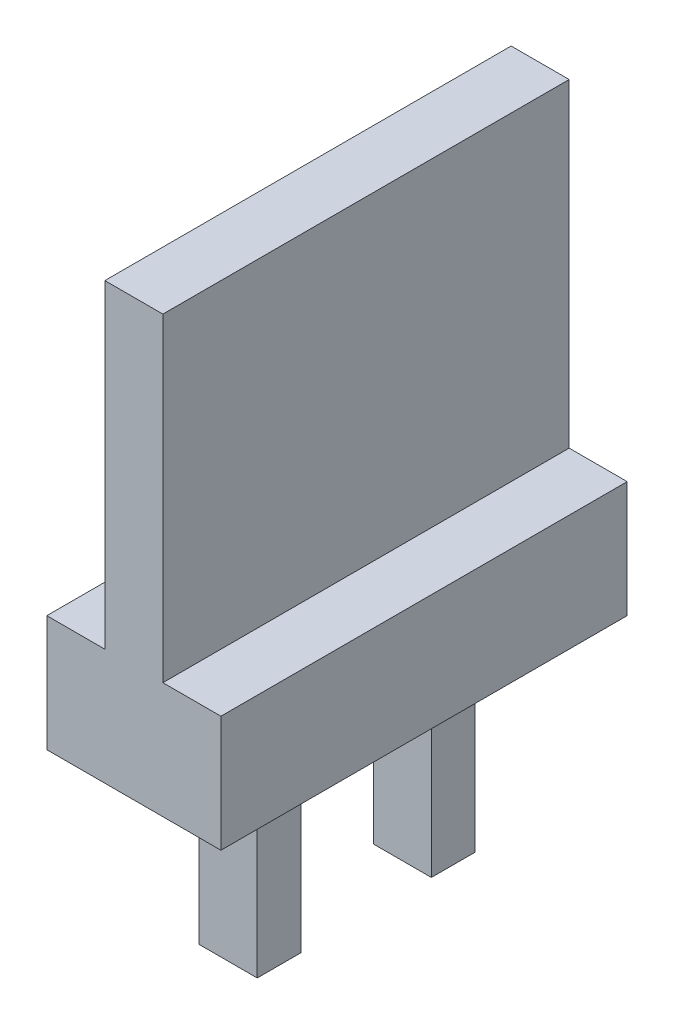
ISO-10303-21;
HEADER;
FILE_DESCRIPTION(('STEP AP214'),'2;1');
FILE_NAME('part.step','',(''),(''),'','','');
FILE_SCHEMA(('AUTOMOTIVE_DESIGN { 1 0 10303 214 1 1 1 1 }'));
ENDSEC;
DATA;
#1=APPLICATION_CONTEXT('core data for automotive mechanical design processes');
#2=APPLICATION_PROTOCOL_DEFINITION('international standard','automotive_design',2000,#1);
#3=PRODUCT_CONTEXT('',#1,'mechanical');
#4=PRODUCT('Part','Part','',(#3));
#5=PRODUCT_RELATED_PRODUCT_CATEGORY('part','',(#4));
#6=PRODUCT_DEFINITION_FORMATION('','',#4);
#7=PRODUCT_DEFINITION_CONTEXT('part definition',#1,'design');
#8=PRODUCT_DEFINITION('design','',#6,#7);
#9=PRODUCT_DEFINITION_SHAPE('','',#8);
#10=(LENGTH_UNIT() NAMED_UNIT(*) SI_UNIT(.MILLI.,.METRE.));
#11=(NAMED_UNIT(*) PLANE_ANGLE_UNIT() SI_UNIT($,.RADIAN.));
#12=(NAMED_UNIT(*) SI_UNIT($,.STERADIAN.) SOLID_ANGLE_UNIT());
#13=UNCERTAINTY_MEASURE_WITH_UNIT(LENGTH_MEASURE(1.E-05),#10,'distance_accuracy_value','');
#14=(GEOMETRIC_REPRESENTATION_CONTEXT(3) GLOBAL_UNCERTAINTY_ASSIGNED_CONTEXT((#13)) GLOBAL_UNIT_ASSIGNED_CONTEXT((#10,
#11,#12)) REPRESENTATION_CONTEXT('',''));
#15=CARTESIAN_POINT('',(0.,0.,0.));
#16=DIRECTION('',(0.,0.,1.));
#17=DIRECTION('',(1.,0.,0.));
#18=AXIS2_PLACEMENT_3D('',#15,#16,#17);
#19=CARTESIAN_POINT('',(-2.20614541019622,-8.26530612244898,9.5));
#20=DIRECTION('',(0.,1.,0.));
#21=DIRECTION('',(0.,0.,1.));
#22=AXIS2_PLACEMENT_3D('',#19,#20,#21);
#23=PLANE('',#22);
#24=DIRECTION('',(1.,0.,0.));
#25=VECTOR('',#24,1.);
#26=CARTESIAN_POINT('',(-2.20614541019622,-8.26530612244898,6.5));
#27=LINE('',#26,#25);
#28=CARTESIAN_POINT('',(-2.20614541019622,-8.26530612244898,6.5));
#29=VERTEX_POINT('',#28);
#30=CARTESIAN_POINT('',(1.79385458980378,-8.26530612244898,6.5));
#31=VERTEX_POINT('',#30);
#32=EDGE_CURVE('E108',#29,#31,#27,.T.);
#33=ORIENTED_EDGE('',*,*,#32,.F.);
#34=DIRECTION('',(0.,0.,-1.));
#35=VECTOR('',#34,1.);
#36=CARTESIAN_POINT('',(-2.20614541019622,-8.26530612244898,9.5));
#37=LINE('',#36,#35);
#38=CARTESIAN_POINT('',(-2.20614541019622,-8.26530612244898,9.5));
#39=VERTEX_POINT('',#38);
#40=EDGE_CURVE('E12',#39,#29,#37,.T.);
#41=ORIENTED_EDGE('',*,*,#40,.F.);
#42=DIRECTION('',(1.,0.,0.));
#43=VECTOR('',#42,1.);
#44=CARTESIAN_POINT('',(-2.20614541019622,-8.26530612244898,9.5));
#45=LINE('',#44,#43);
#46=CARTESIAN_POINT('',(1.79385458980378,-8.26530612244898,9.5));
#47=VERTEX_POINT('',#46);
#48=EDGE_CURVE('E102',#39,#47,#45,.T.);
#49=ORIENTED_EDGE('',*,*,#48,.T.);
#50=DIRECTION('',(0.,0.,-1.));
#51=VECTOR('',#50,1.);
#52=CARTESIAN_POINT('',(1.79385458980378,-8.26530612244898,9.5));
#53=LINE('',#52,#51);
#54=EDGE_CURVE('E47',#47,#31,#53,.T.);
#55=ORIENTED_EDGE('',*,*,#54,.T.);
#56=EDGE_LOOP('',(#33,#41,#49,#55));
#57=FACE_BOUND('',#56,.T.);
#58=ADVANCED_FACE('F44',(#57),#23,.T.);
#59=CARTESIAN_POINT('',(-2.20614541019622,-19.139320219842,9.5));
#60=DIRECTION('',(-1.,0.,0.));
#61=DIRECTION('',(0.,0.,1.));
#62=AXIS2_PLACEMENT_3D('',#59,#60,#61);
#63=PLANE('',#62);
#64=DIRECTION('',(0.,1.,0.));
#65=VECTOR('',#64,1.);
#66=CARTESIAN_POINT('',(-2.20614541019622,-19.139320219842,6.5));
#67=LINE('',#66,#65);
#68=CARTESIAN_POINT('',(-2.20614541019622,-19.139320219842,6.5));
#69=VERTEX_POINT('',#68);
#70=EDGE_CURVE('E104',#69,#29,#67,.T.);
#71=ORIENTED_EDGE('',*,*,#70,.F.);
#72=DIRECTION('',(0.,0.,-1.));
#73=VECTOR('',#72,1.);
#74=CARTESIAN_POINT('',(-2.20614541019622,-19.139320219842,9.5));
#75=LINE('',#74,#73);
#76=CARTESIAN_POINT('',(-2.20614541019622,-19.139320219842,9.5));
#77=VERTEX_POINT('',#76);
#78=EDGE_CURVE('E53',#77,#69,#75,.T.);
#79=ORIENTED_EDGE('',*,*,#78,.F.);
#80=DIRECTION('',(0.,1.,0.));
#81=VECTOR('',#80,1.);
#82=CARTESIAN_POINT('',(-2.20614541019622,-19.139320219842,9.5));
#83=LINE('',#82,#81);
#84=EDGE_CURVE('E99',#77,#39,#83,.T.);
#85=ORIENTED_EDGE('',*,*,#84,.T.);
#86=ORIENTED_EDGE('',*,*,#40,.T.);
#87=EDGE_LOOP('',(#71,#79,#85,#86));
#88=FACE_BOUND('',#87,.T.);
#89=ADVANCED_FACE('F118',(#88),#63,.T.);
#90=CARTESIAN_POINT('',(1.79385458980378,-19.139320219842,9.5));
#91=DIRECTION('',(0.,-1.,0.));
#92=DIRECTION('',(0.,0.,-1.));
#93=AXIS2_PLACEMENT_3D('',#90,#91,#92);
#94=PLANE('',#93);
#95=DIRECTION('',(-1.,0.,0.));
#96=VECTOR('',#95,1.);
#97=CARTESIAN_POINT('',(1.79385458980378,-19.139320219842,6.5));
#98=LINE('',#97,#96);
#99=CARTESIAN_POINT('',(1.79385458980378,-19.139320219842,6.5));
#100=VERTEX_POINT('',#99);
#101=EDGE_CURVE('E94',#100,#69,#98,.T.);
#102=ORIENTED_EDGE('',*,*,#101,.F.);
#103=DIRECTION('',(0.,0.,-1.));
#104=VECTOR('',#103,1.);
#105=CARTESIAN_POINT('',(1.79385458980378,-19.139320219842,9.5));
#106=LINE('',#105,#104);
#107=CARTESIAN_POINT('',(1.79385458980378,-19.139320219842,9.5));
#108=VERTEX_POINT('',#107);
#109=EDGE_CURVE('E89',#108,#100,#106,.T.);
#110=ORIENTED_EDGE('',*,*,#109,.F.);
#111=DIRECTION('',(-1.,0.,0.));
#112=VECTOR('',#111,1.);
#113=CARTESIAN_POINT('',(1.79385458980378,-19.139320219842,9.5));
#114=LINE('',#113,#112);
#115=EDGE_CURVE('E92',#108,#77,#114,.T.);
#116=ORIENTED_EDGE('',*,*,#115,.T.);
#117=ORIENTED_EDGE('',*,*,#78,.T.);
#118=EDGE_LOOP('',(#102,#110,#116,#117));
#119=FACE_BOUND('',#118,.T.);
#120=ADVANCED_FACE('F91',(#119),#94,.T.);
#121=CARTESIAN_POINT('',(1.79385458980378,-8.26530612244898,9.5));
#122=DIRECTION('',(1.,0.,0.));
#123=DIRECTION('',(0.,0.,-1.));
#124=AXIS2_PLACEMENT_3D('',#121,#122,#123);
#125=PLANE('',#124);
#126=DIRECTION('',(0.,-1.,0.));
#127=VECTOR('',#126,1.);
#128=CARTESIAN_POINT('',(1.79385458980378,-8.26530612244898,6.5));
#129=LINE('',#128,#127);
#130=EDGE_CURVE('E111',#31,#100,#129,.T.);
#131=ORIENTED_EDGE('',*,*,#130,.F.);
#132=ORIENTED_EDGE('',*,*,#54,.F.);
#133=DIRECTION('',(0.,-1.,0.));
#134=VECTOR('',#133,1.);
#135=CARTESIAN_POINT('',(1.79385458980378,-8.26530612244898,9.5));
#136=LINE('',#135,#134);
#137=EDGE_CURVE('E98',#47,#108,#136,.T.);
#138=ORIENTED_EDGE('',*,*,#137,.T.);
#139=ORIENTED_EDGE('',*,*,#109,.T.);
#140=EDGE_LOOP('',(#131,#132,#138,#139));
#141=FACE_BOUND('',#140,.T.);
#142=ADVANCED_FACE('F101',(#141),#125,.T.);
#143=CARTESIAN_POINT('',(0.,0.,9.5));
#144=DIRECTION('',(0.,0.,-1.));
#145=DIRECTION('',(-1.,0.,0.));
#146=AXIS2_PLACEMENT_3D('',#143,#144,#145);
#147=PLANE('',#146);
#148=ORIENTED_EDGE('',*,*,#48,.F.);
#149=ORIENTED_EDGE('',*,*,#84,.F.);
#150=ORIENTED_EDGE('',*,*,#115,.F.);
#151=ORIENTED_EDGE('',*,*,#137,.F.);
#152=EDGE_LOOP('',(#148,#149,#150,#151));
#153=FACE_BOUND('',#152,.T.);
#154=ADVANCED_FACE('F97',(#153),#147,.F.);
#155=CARTESIAN_POINT('',(0.,0.,6.5));
#156=DIRECTION('',(0.,0.,-1.));
#157=DIRECTION('',(-1.,0.,0.));
#158=AXIS2_PLACEMENT_3D('',#155,#156,#157);
#159=PLANE('',#158);
#160=ORIENTED_EDGE('',*,*,#32,.T.);
#161=ORIENTED_EDGE('',*,*,#130,.T.);
#162=ORIENTED_EDGE('',*,*,#101,.T.);
#163=ORIENTED_EDGE('',*,*,#70,.T.);
#164=EDGE_LOOP('',(#160,#161,#162,#163));
#165=FACE_BOUND('',#164,.T.);
#166=ADVANCED_FACE('F117',(#165),#159,.T.);
#167=CLOSED_SHELL('',(#58,#89,#120,#142,#154,#166));
#168=MANIFOLD_SOLID_BREP('B2',#167);
#169=CARTESIAN_POINT('',(5.79136789851076,-6.26530612244898,28.));
#170=DIRECTION('',(0.,1.,0.));
#171=DIRECTION('',(-1.,0.,0.));
#172=AXIS2_PLACEMENT_3D('',#169,#170,#171);
#173=PLANE('',#172);
#174=DIRECTION('',(1.,0.,0.));
#175=VECTOR('',#174,1.);
#176=CARTESIAN_POINT('',(5.79136789851076,-6.26530612244898,0.));
#177=LINE('',#176,#175);
#178=CARTESIAN_POINT('',(-6.20863210148924,-6.26530612244898,0.));
#179=VERTEX_POINT('',#178);
#180=CARTESIAN_POINT('',(5.79136789851076,-6.26530612244898,0.));
#181=VERTEX_POINT('',#180);
#182=EDGE_CURVE('E370',#179,#181,#177,.T.);
#183=ORIENTED_EDGE('',*,*,#182,.T.);
#184=DIRECTION('',(0.,0.,-1.));
#185=VECTOR('',#184,1.);
#186=CARTESIAN_POINT('',(5.79136789851076,-6.26530612244898,28.));
#187=LINE('',#186,#185);
#188=CARTESIAN_POINT('',(5.79136789851076,-6.26530612244898,28.));
#189=VERTEX_POINT('',#188);
#190=EDGE_CURVE('E395',#189,#181,#187,.T.);
#191=ORIENTED_EDGE('',*,*,#190,.F.);
#192=DIRECTION('',(1.,0.,0.));
#193=VECTOR('',#192,1.);
#194=CARTESIAN_POINT('',(5.79136789851076,-6.26530612244898,28.));
#195=LINE('',#194,#193);
#196=CARTESIAN_POINT('',(-6.20863210148924,-6.26530612244898,28.));
#197=VERTEX_POINT('',#196);
#198=EDGE_CURVE('E353',#197,#189,#195,.T.);
#199=ORIENTED_EDGE('',*,*,#198,.F.);
#200=DIRECTION('',(0.,0.,-1.));
#201=VECTOR('',#200,1.);
#202=CARTESIAN_POINT('',(-6.20863210148924,-6.26530612244898,28.));
#203=LINE('',#202,#201);
#204=EDGE_CURVE('E175',#197,#179,#203,.T.);
#205=ORIENTED_EDGE('',*,*,#204,.T.);
#206=EDGE_LOOP('',(#183,#191,#199,#205));
#207=FACE_BOUND('',#206,.T.);
#208=DIRECTION('',(-1.,0.,0.));
#209=VECTOR('',#208,1.);
#210=CARTESIAN_POINT('',(3.79136789851076,-6.26530612244898,21.5));
#211=LINE('',#210,#209);
#212=CARTESIAN_POINT('',(3.79136789851076,-6.26530612244898,21.5));
#213=VERTEX_POINT('',#212);
#214=CARTESIAN_POINT('',(-4.20863210148925,-6.26530612244898,21.5));
#215=VERTEX_POINT('',#214);
#216=EDGE_CURVE('E190',#213,#215,#211,.T.);
#217=ORIENTED_EDGE('',*,*,#216,.F.);
#218=DIRECTION('',(0.,0.,1.));
#219=VECTOR('',#218,1.);
#220=CARTESIAN_POINT('',(3.79136789851076,-6.26530612244898,6.5));
#221=LINE('',#220,#219);
#222=CARTESIAN_POINT('',(3.79136789851076,-6.26530612244898,6.5));
#223=VERTEX_POINT('',#222);
#224=EDGE_CURVE('E333',#223,#213,#221,.T.);
#225=ORIENTED_EDGE('',*,*,#224,.F.);
#226=DIRECTION('',(1.,0.,0.));
#227=VECTOR('',#226,1.);
#228=CARTESIAN_POINT('',(-4.20863210148924,-6.26530612244898,6.5));
#229=LINE('',#228,#227);
#230=CARTESIAN_POINT('',(-4.20863210148924,-6.26530612244898,6.5));
#231=VERTEX_POINT('',#230);
#232=EDGE_CURVE('E330',#231,#223,#229,.T.);
#233=ORIENTED_EDGE('',*,*,#232,.F.);
#234=DIRECTION('',(0.,0.,-1.));
#235=VECTOR('',#234,1.);
#236=CARTESIAN_POINT('',(-4.20863210148925,-6.26530612244898,21.5));
#237=LINE('',#236,#235);
#238=EDGE_CURVE('E327',#215,#231,#237,.T.);
#239=ORIENTED_EDGE('',*,*,#238,.F.);
#240=EDGE_LOOP('',(#217,#225,#233,#239));
#241=FACE_BOUND('',#240,.T.);
#242=ADVANCED_FACE('F167',(#207,#241),#173,.F.);
#243=CARTESIAN_POINT('',(-6.20863210148924,1.73469387755102,28.));
#244=DIRECTION('',(0.,-1.,0.));
#245=DIRECTION('',(0.,0.,-1.));
#246=AXIS2_PLACEMENT_3D('',#243,#244,#245);
#247=PLANE('',#246);
#248=DIRECTION('',(-1.,0.,0.));
#249=VECTOR('',#248,1.);
#250=CARTESIAN_POINT('',(-6.20863210148924,1.73469387755102,0.));
#251=LINE('',#250,#249);
#252=CARTESIAN_POINT('',(-2.20863210148924,1.73469387755102,0.));
#253=VERTEX_POINT('',#252);
#254=CARTESIAN_POINT('',(-6.20863210148924,1.73469387755102,0.));
#255=VERTEX_POINT('',#254);
#256=EDGE_CURVE('E346',#253,#255,#251,.T.);
#257=ORIENTED_EDGE('',*,*,#256,.T.);
#258=DIRECTION('',(0.,0.,-1.));
#259=VECTOR('',#258,1.);
#260=CARTESIAN_POINT('',(-6.20863210148924,1.73469387755102,28.));
#261=LINE('',#260,#259);
#262=CARTESIAN_POINT('',(-6.20863210148924,1.73469387755102,28.));
#263=VERTEX_POINT('',#262);
#264=EDGE_CURVE('E42',#263,#255,#261,.T.);
#265=ORIENTED_EDGE('',*,*,#264,.F.);
#266=DIRECTION('',(-1.,0.,0.));
#267=VECTOR('',#266,1.);
#268=CARTESIAN_POINT('',(-6.20863210148924,1.73469387755102,28.));
#269=LINE('',#268,#267);
#270=CARTESIAN_POINT('',(-2.20863210148924,1.73469387755102,28.));
#271=VERTEX_POINT('',#270);
#272=EDGE_CURVE('E347',#271,#263,#269,.T.);
#273=ORIENTED_EDGE('',*,*,#272,.F.);
#274=DIRECTION('',(0.,0.,-1.));
#275=VECTOR('',#274,1.);
#276=CARTESIAN_POINT('',(-2.20863210148924,1.73469387755102,28.));
#277=LINE('',#276,#275);
#278=EDGE_CURVE('E365',#271,#253,#277,.T.);
#279=ORIENTED_EDGE('',*,*,#278,.T.);
#280=EDGE_LOOP('',(#257,#265,#273,#279));
#281=FACE_BOUND('',#280,.T.);
#282=ADVANCED_FACE('F169',(#281),#247,.F.);
#283=CARTESIAN_POINT('',(-6.20863210148924,-6.26530612244898,28.));
#284=DIRECTION('',(1.,0.,0.));
#285=DIRECTION('',(0.,1.,0.));
#286=AXIS2_PLACEMENT_3D('',#283,#284,#285);
#287=PLANE('',#286);
#288=DIRECTION('',(0.,-1.,0.));
#289=VECTOR('',#288,1.);
#290=CARTESIAN_POINT('',(-6.20863210148924,-6.26530612244898,0.));
#291=LINE('',#290,#289);
#292=EDGE_CURVE('E368',#255,#179,#291,.T.);
#293=ORIENTED_EDGE('',*,*,#292,.T.);
#294=ORIENTED_EDGE('',*,*,#204,.F.);
#295=DIRECTION('',(0.,-1.,0.));
#296=VECTOR('',#295,1.);
#297=CARTESIAN_POINT('',(-6.20863210148924,-6.26530612244898,28.));
#298=LINE('',#297,#296);
#299=EDGE_CURVE('E350',#263,#197,#298,.T.);
#300=ORIENTED_EDGE('',*,*,#299,.F.);
#301=ORIENTED_EDGE('',*,*,#264,.T.);
#302=EDGE_LOOP('',(#293,#294,#300,#301));
#303=FACE_BOUND('',#302,.T.);
#304=ADVANCED_FACE('F424',(#303),#287,.F.);
#305=CARTESIAN_POINT('',(5.79136789851076,1.73469387755102,28.));
#306=DIRECTION('',(-1.,0.,0.));
#307=DIRECTION('',(0.,-1.,0.));
#308=AXIS2_PLACEMENT_3D('',#305,#306,#307);
#309=PLANE('',#308);
#310=DIRECTION('',(0.,1.,0.));
#311=VECTOR('',#310,1.);
#312=CARTESIAN_POINT('',(5.79136789851076,1.73469387755102,0.));
#313=LINE('',#312,#311);
#314=CARTESIAN_POINT('',(5.79136789851076,1.73469387755102,0.));
#315=VERTEX_POINT('',#314);
#316=EDGE_CURVE('E372',#181,#315,#313,.T.);
#317=ORIENTED_EDGE('',*,*,#316,.T.);
#318=DIRECTION('',(0.,0.,-1.));
#319=VECTOR('',#318,1.);
#320=CARTESIAN_POINT('',(5.79136789851076,1.73469387755102,28.));
#321=LINE('',#320,#319);
#322=CARTESIAN_POINT('',(5.79136789851076,1.73469387755102,28.));
#323=VERTEX_POINT('',#322);
#324=EDGE_CURVE('E392',#323,#315,#321,.T.);
#325=ORIENTED_EDGE('',*,*,#324,.F.);
#326=DIRECTION('',(0.,1.,0.));
#327=VECTOR('',#326,1.);
#328=CARTESIAN_POINT('',(5.79136789851076,1.73469387755102,28.));
#329=LINE('',#328,#327);
#330=EDGE_CURVE('E355',#189,#323,#329,.T.);
#331=ORIENTED_EDGE('',*,*,#330,.F.);
#332=ORIENTED_EDGE('',*,*,#190,.T.);
#333=EDGE_LOOP('',(#317,#325,#331,#332));
#334=FACE_BOUND('',#333,.T.);
#335=ADVANCED_FACE('F412',(#334),#309,.F.);
#336=CARTESIAN_POINT('',(1.79136789851076,1.73469387755102,28.));
#337=DIRECTION('',(0.,-1.,0.));
#338=DIRECTION('',(0.,0.,-1.));
#339=AXIS2_PLACEMENT_3D('',#336,#337,#338);
#340=PLANE('',#339);
#341=DIRECTION('',(-1.,0.,0.));
#342=VECTOR('',#341,1.);
#343=CARTESIAN_POINT('',(1.79136789851076,1.73469387755102,0.));
#344=LINE('',#343,#342);
#345=CARTESIAN_POINT('',(1.79136789851076,1.73469387755102,0.));
#346=VERTEX_POINT('',#345);
#347=EDGE_CURVE('E374',#315,#346,#344,.T.);
#348=ORIENTED_EDGE('',*,*,#347,.T.);
#349=DIRECTION('',(0.,0.,-1.));
#350=VECTOR('',#349,1.);
#351=CARTESIAN_POINT('',(1.79136789851076,1.73469387755102,28.));
#352=LINE('',#351,#350);
#353=CARTESIAN_POINT('',(1.79136789851076,1.73469387755102,28.));
#354=VERTEX_POINT('',#353);
#355=EDGE_CURVE('E389',#354,#346,#352,.T.);
#356=ORIENTED_EDGE('',*,*,#355,.F.);
#357=DIRECTION('',(-1.,0.,0.));
#358=VECTOR('',#357,1.);
#359=CARTESIAN_POINT('',(1.79136789851076,1.73469387755102,28.));
#360=LINE('',#359,#358);
#361=EDGE_CURVE('E357',#323,#354,#360,.T.);
#362=ORIENTED_EDGE('',*,*,#361,.F.);
#363=ORIENTED_EDGE('',*,*,#324,.T.);
#364=EDGE_LOOP('',(#348,#356,#362,#363));
#365=FACE_BOUND('',#364,.T.);
#366=ADVANCED_FACE('F416',(#365),#340,.F.);
#367=CARTESIAN_POINT('',(1.79136789851076,23.734693877551,28.));
#368=DIRECTION('',(-1.,0.,0.));
#369=DIRECTION('',(0.,-1.,0.));
#370=AXIS2_PLACEMENT_3D('',#367,#368,#369);
#371=PLANE('',#370);
#372=DIRECTION('',(0.,1.,0.));
#373=VECTOR('',#372,1.);
#374=CARTESIAN_POINT('',(1.79136789851076,23.734693877551,0.));
#375=LINE('',#374,#373);
#376=CARTESIAN_POINT('',(1.79136789851076,23.734693877551,0.));
#377=VERTEX_POINT('',#376);
#378=EDGE_CURVE('E376',#346,#377,#375,.T.);
#379=ORIENTED_EDGE('',*,*,#378,.T.);
#380=DIRECTION('',(0.,0.,-1.));
#381=VECTOR('',#380,1.);
#382=CARTESIAN_POINT('',(1.79136789851076,23.734693877551,28.));
#383=LINE('',#382,#381);
#384=CARTESIAN_POINT('',(1.79136789851076,23.734693877551,28.));
#385=VERTEX_POINT('',#384);
#386=EDGE_CURVE('E386',#385,#377,#383,.T.);
#387=ORIENTED_EDGE('',*,*,#386,.F.);
#388=DIRECTION('',(0.,1.,0.));
#389=VECTOR('',#388,1.);
#390=CARTESIAN_POINT('',(1.79136789851076,23.734693877551,28.));
#391=LINE('',#390,#389);
#392=EDGE_CURVE('E359',#354,#385,#391,.T.);
#393=ORIENTED_EDGE('',*,*,#392,.F.);
#394=ORIENTED_EDGE('',*,*,#355,.T.);
#395=EDGE_LOOP('',(#379,#387,#393,#394));
#396=FACE_BOUND('',#395,.T.);
#397=ADVANCED_FACE('F437',(#396),#371,.F.);
#398=CARTESIAN_POINT('',(-2.20863210148924,23.734693877551,28.));
#399=DIRECTION('',(0.,-1.,0.));
#400=DIRECTION('',(0.,0.,-1.));
#401=AXIS2_PLACEMENT_3D('',#398,#399,#400);
#402=PLANE('',#401);
#403=DIRECTION('',(-1.,0.,0.));
#404=VECTOR('',#403,1.);
#405=CARTESIAN_POINT('',(-2.20863210148924,23.734693877551,0.));
#406=LINE('',#405,#404);
#407=CARTESIAN_POINT('',(-2.20863210148924,23.734693877551,0.));
#408=VERTEX_POINT('',#407);
#409=EDGE_CURVE('E378',#377,#408,#406,.T.);
#410=ORIENTED_EDGE('',*,*,#409,.T.);
#411=DIRECTION('',(0.,0.,-1.));
#412=VECTOR('',#411,1.);
#413=CARTESIAN_POINT('',(-2.20863210148924,23.734693877551,28.));
#414=LINE('',#413,#412);
#415=CARTESIAN_POINT('',(-2.20863210148924,23.734693877551,28.));
#416=VERTEX_POINT('',#415);
#417=EDGE_CURVE('E383',#416,#408,#414,.T.);
#418=ORIENTED_EDGE('',*,*,#417,.F.);
#419=DIRECTION('',(-1.,0.,0.));
#420=VECTOR('',#419,1.);
#421=CARTESIAN_POINT('',(-2.20863210148924,23.734693877551,28.));
#422=LINE('',#421,#420);
#423=EDGE_CURVE('E361',#385,#416,#422,.T.);
#424=ORIENTED_EDGE('',*,*,#423,.F.);
#425=ORIENTED_EDGE('',*,*,#386,.T.);
#426=EDGE_LOOP('',(#410,#418,#424,#425));
#427=FACE_BOUND('',#426,.T.);
#428=ADVANCED_FACE('F435',(#427),#402,.F.);
#429=CARTESIAN_POINT('',(-2.20863210148924,1.73469387755102,28.));
#430=DIRECTION('',(1.,0.,0.));
#431=DIRECTION('',(0.,1.,0.));
#432=AXIS2_PLACEMENT_3D('',#429,#430,#431);
#433=PLANE('',#432);
#434=DIRECTION('',(0.,-1.,0.));
#435=VECTOR('',#434,1.);
#436=CARTESIAN_POINT('',(-2.20863210148924,1.73469387755102,0.));
#437=LINE('',#436,#435);
#438=EDGE_CURVE('E351',#408,#253,#437,.T.);
#439=ORIENTED_EDGE('',*,*,#438,.T.);
#440=ORIENTED_EDGE('',*,*,#278,.F.);
#441=DIRECTION('',(0.,-1.,0.));
#442=VECTOR('',#441,1.);
#443=CARTESIAN_POINT('',(-2.20863210148924,1.73469387755102,28.));
#444=LINE('',#443,#442);
#445=EDGE_CURVE('E363',#416,#271,#444,.T.);
#446=ORIENTED_EDGE('',*,*,#445,.F.);
#447=ORIENTED_EDGE('',*,*,#417,.T.);
#448=EDGE_LOOP('',(#439,#440,#446,#447));
#449=FACE_BOUND('',#448,.T.);
#450=ADVANCED_FACE('F430',(#449),#433,.F.);
#451=CARTESIAN_POINT('',(0.,0.,28.));
#452=DIRECTION('',(0.,0.,1.));
#453=DIRECTION('',(1.,0.,0.));
#454=AXIS2_PLACEMENT_3D('',#451,#452,#453);
#455=PLANE('',#454);
#456=ORIENTED_EDGE('',*,*,#272,.T.);
#457=ORIENTED_EDGE('',*,*,#299,.T.);
#458=ORIENTED_EDGE('',*,*,#198,.T.);
#459=ORIENTED_EDGE('',*,*,#330,.T.);
#460=ORIENTED_EDGE('',*,*,#361,.T.);
#461=ORIENTED_EDGE('',*,*,#392,.T.);
#462=ORIENTED_EDGE('',*,*,#423,.T.);
#463=ORIENTED_EDGE('',*,*,#445,.T.);
#464=EDGE_LOOP('',(#456,#457,#458,#459,#460,#461,#462,#463));
#465=FACE_BOUND('',#464,.T.);
#466=ADVANCED_FACE('F420',(#465),#455,.T.);
#467=CARTESIAN_POINT('',(0.,0.,0.));
#468=DIRECTION('',(0.,0.,1.));
#469=DIRECTION('',(1.,0.,0.));
#470=AXIS2_PLACEMENT_3D('',#467,#468,#469);
#471=PLANE('',#470);
#472=ORIENTED_EDGE('',*,*,#256,.F.);
#473=ORIENTED_EDGE('',*,*,#438,.F.);
#474=ORIENTED_EDGE('',*,*,#409,.F.);
#475=ORIENTED_EDGE('',*,*,#378,.F.);
#476=ORIENTED_EDGE('',*,*,#347,.F.);
#477=ORIENTED_EDGE('',*,*,#316,.F.);
#478=ORIENTED_EDGE('',*,*,#182,.F.);
#479=ORIENTED_EDGE('',*,*,#292,.F.);
#480=EDGE_LOOP('',(#472,#473,#474,#475,#476,#477,#478,#479));
#481=FACE_BOUND('',#480,.T.);
#482=ADVANCED_FACE('F407',(#481),#471,.F.);
#483=CARTESIAN_POINT('',(3.79136789851076,-8.26530612244898,21.5));
#484=DIRECTION('',(0.,0.,-1.));
#485=DIRECTION('',(-1.,0.,0.));
#486=AXIS2_PLACEMENT_3D('',#483,#484,#485);
#487=PLANE('',#486);
#488=ORIENTED_EDGE('',*,*,#216,.T.);
#489=DIRECTION('',(0.,1.,0.));
#490=VECTOR('',#489,1.);
#491=CARTESIAN_POINT('',(-4.20863210148925,-8.26530612244898,21.5));
#492=LINE('',#491,#490);
#493=CARTESIAN_POINT('',(-4.20863210148925,-8.26530612244898,21.5));
#494=VERTEX_POINT('',#493);
#495=EDGE_CURVE('E343',#494,#215,#492,.T.);
#496=ORIENTED_EDGE('',*,*,#495,.F.);
#497=DIRECTION('',(-1.,0.,0.));
#498=VECTOR('',#497,1.);
#499=CARTESIAN_POINT('',(3.79136789851076,-8.26530612244898,21.5));
#500=LINE('',#499,#498);
#501=CARTESIAN_POINT('',(-2.20614541019622,-8.26530612244898,21.5));
#502=VERTEX_POINT('',#501);
#503=EDGE_CURVE('E319',#502,#494,#500,.T.);
#504=ORIENTED_EDGE('',*,*,#503,.F.);
#505=DIRECTION('',(0.,-1.,0.));
#506=VECTOR('',#505,1.);
#507=CARTESIAN_POINT('',(-2.20614541019622,-8.26530612244898,21.5));
#508=LINE('',#507,#506);
#509=CARTESIAN_POINT('',(-2.20614541019622,-19.139320219842,21.5));
#510=VERTEX_POINT('',#509);
#511=EDGE_CURVE('E182',#502,#510,#508,.T.);
#512=ORIENTED_EDGE('',*,*,#511,.T.);
#513=DIRECTION('',(1.,0.,0.));
#514=VECTOR('',#513,1.);
#515=CARTESIAN_POINT('',(-2.20614541019622,-19.139320219842,21.5));
#516=LINE('',#515,#514);
#517=CARTESIAN_POINT('',(1.79385458980378,-19.139320219842,21.5));
#518=VERTEX_POINT('',#517);
#519=EDGE_CURVE('E304',#510,#518,#516,.T.);
#520=ORIENTED_EDGE('',*,*,#519,.T.);
#521=DIRECTION('',(0.,1.,0.));
#522=VECTOR('',#521,1.);
#523=CARTESIAN_POINT('',(1.79385458980378,-19.139320219842,21.5));
#524=LINE('',#523,#522);
#525=CARTESIAN_POINT('',(1.79385458980378,-8.26530612244898,21.5));
#526=VERTEX_POINT('',#525);
#527=EDGE_CURVE('E301',#518,#526,#524,.T.);
#528=ORIENTED_EDGE('',*,*,#527,.T.);
#529=CARTESIAN_POINT('',(3.79136789851076,-8.26530612244898,21.5));
#530=VERTEX_POINT('',#529);
#531=EDGE_CURVE('E316',#530,#526,#500,.T.);
#532=ORIENTED_EDGE('',*,*,#531,.F.);
#533=DIRECTION('',(0.,1.,0.));
#534=VECTOR('',#533,1.);
#535=CARTESIAN_POINT('',(3.79136789851076,-8.26530612244898,21.5));
#536=LINE('',#535,#534);
#537=EDGE_CURVE('E325',#530,#213,#536,.T.);
#538=ORIENTED_EDGE('',*,*,#537,.T.);
#539=EDGE_LOOP('',(#488,#496,#504,#512,#520,#528,#532,#538));
#540=FACE_BOUND('',#539,.T.);
#541=ADVANCED_FACE('F496',(#540),#487,.F.);
#542=CARTESIAN_POINT('',(-4.20863210148925,-8.26530612244898,21.5));
#543=DIRECTION('',(1.,0.,0.));
#544=DIRECTION('',(0.,1.,0.));
#545=AXIS2_PLACEMENT_3D('',#542,#543,#544);
#546=PLANE('',#545);
#547=ORIENTED_EDGE('',*,*,#238,.T.);
#548=DIRECTION('',(0.,1.,0.));
#549=VECTOR('',#548,1.);
#550=CARTESIAN_POINT('',(-4.20863210148924,-8.26530612244898,6.5));
#551=LINE('',#550,#549);
#552=CARTESIAN_POINT('',(-4.20863210148924,-8.26530612244898,6.5));
#553=VERTEX_POINT('',#552);
#554=EDGE_CURVE('E340',#553,#231,#551,.T.);
#555=ORIENTED_EDGE('',*,*,#554,.F.);
#556=DIRECTION('',(0.,0.,-1.));
#557=VECTOR('',#556,1.);
#558=CARTESIAN_POINT('',(-4.20863210148925,-8.26530612244898,21.5));
#559=LINE('',#558,#557);
#560=EDGE_CURVE('E318',#494,#553,#559,.T.);
#561=ORIENTED_EDGE('',*,*,#560,.F.);
#562=ORIENTED_EDGE('',*,*,#495,.T.);
#563=EDGE_LOOP('',(#547,#555,#561,#562));
#564=FACE_BOUND('',#563,.T.);
#565=ADVANCED_FACE('F508',(#564),#546,.F.);
#566=CARTESIAN_POINT('',(-4.20863210148924,-8.26530612244898,6.5));
#567=DIRECTION('',(0.,0.,1.));
#568=DIRECTION('',(1.,0.,0.));
#569=AXIS2_PLACEMENT_3D('',#566,#567,#568);
#570=PLANE('',#569);
#571=ORIENTED_EDGE('',*,*,#232,.T.);
#572=DIRECTION('',(0.,1.,0.));
#573=VECTOR('',#572,1.);
#574=CARTESIAN_POINT('',(3.79136789851076,-8.26530612244898,6.5));
#575=LINE('',#574,#573);
#576=CARTESIAN_POINT('',(3.79136789851076,-8.26530612244898,6.5));
#577=VERTEX_POINT('',#576);
#578=EDGE_CURVE('E337',#577,#223,#575,.T.);
#579=ORIENTED_EDGE('',*,*,#578,.F.);
#580=DIRECTION('',(1.,0.,0.));
#581=VECTOR('',#580,1.);
#582=CARTESIAN_POINT('',(-4.20863210148924,-8.26530612244898,6.5));
#583=LINE('',#582,#581);
#584=EDGE_CURVE('E321',#553,#577,#583,.T.);
#585=ORIENTED_EDGE('',*,*,#584,.F.);
#586=ORIENTED_EDGE('',*,*,#554,.T.);
#587=EDGE_LOOP('',(#571,#579,#585,#586));
#588=FACE_BOUND('',#587,.T.);
#589=ADVANCED_FACE('F513',(#588),#570,.F.);
#590=CARTESIAN_POINT('',(3.79136789851076,-8.26530612244898,6.5));
#591=DIRECTION('',(-1.,0.,0.));
#592=DIRECTION('',(0.,-1.,0.));
#593=AXIS2_PLACEMENT_3D('',#590,#591,#592);
#594=PLANE('',#593);
#595=ORIENTED_EDGE('',*,*,#224,.T.);
#596=ORIENTED_EDGE('',*,*,#537,.F.);
#597=DIRECTION('',(0.,0.,1.));
#598=VECTOR('',#597,1.);
#599=CARTESIAN_POINT('',(3.79136789851076,-8.26530612244898,6.5));
#600=LINE('',#599,#598);
#601=EDGE_CURVE('E323',#577,#530,#600,.T.);
#602=ORIENTED_EDGE('',*,*,#601,.F.);
#603=ORIENTED_EDGE('',*,*,#578,.T.);
#604=EDGE_LOOP('',(#595,#596,#602,#603));
#605=FACE_BOUND('',#604,.T.);
#606=ADVANCED_FACE('F523',(#605),#594,.F.);
#607=CARTESIAN_POINT('',(0.,-8.26530612244898,0.));
#608=DIRECTION('',(0.,-1.,0.));
#609=DIRECTION('',(1.,0.,0.));
#610=AXIS2_PLACEMENT_3D('',#607,#608,#609);
#611=PLANE('',#610);
#612=DIRECTION('',(0.,0.,1.));
#613=VECTOR('',#612,1.);
#614=CARTESIAN_POINT('',(1.79385458980378,-8.26530612244898,18.5));
#615=LINE('',#614,#613);
#616=CARTESIAN_POINT('',(1.79385458980378,-8.26530612244898,18.5));
#617=VERTEX_POINT('',#616);
#618=EDGE_CURVE('E300',#617,#526,#615,.T.);
#619=ORIENTED_EDGE('',*,*,#618,.F.);
#620=DIRECTION('',(-1.,0.,0.));
#621=VECTOR('',#620,1.);
#622=CARTESIAN_POINT('',(1.79385458980378,-8.26530612244898,18.5));
#623=LINE('',#622,#621);
#624=CARTESIAN_POINT('',(-2.20614541019622,-8.26530612244898,18.5));
#625=VERTEX_POINT('',#624);
#626=EDGE_CURVE('E292',#617,#625,#623,.T.);
#627=ORIENTED_EDGE('',*,*,#626,.T.);
#628=DIRECTION('',(0.,0.,1.));
#629=VECTOR('',#628,1.);
#630=CARTESIAN_POINT('',(-2.20614541019622,-8.26530612244898,18.5));
#631=LINE('',#630,#629);
#632=EDGE_CURVE('E278',#625,#502,#631,.T.);
#633=ORIENTED_EDGE('',*,*,#632,.T.);
#634=ORIENTED_EDGE('',*,*,#503,.T.);
#635=ORIENTED_EDGE('',*,*,#560,.T.);
#636=ORIENTED_EDGE('',*,*,#584,.T.);
#637=ORIENTED_EDGE('',*,*,#601,.T.);
#638=ORIENTED_EDGE('',*,*,#531,.T.);
#639=EDGE_LOOP('',(#619,#627,#633,#634,#635,#636,#637,#638));
#640=FACE_BOUND('',#639,.T.);
#641=ADVANCED_FACE('F298',(#640),#611,.T.);
#642=CARTESIAN_POINT('',(1.79385458980378,-19.139320219842,18.5));
#643=DIRECTION('',(1.,0.,0.));
#644=DIRECTION('',(0.,0.,-1.));
#645=AXIS2_PLACEMENT_3D('',#642,#643,#644);
#646=PLANE('',#645);
#647=ORIENTED_EDGE('',*,*,#527,.F.);
#648=DIRECTION('',(0.,0.,1.));
#649=VECTOR('',#648,1.);
#650=CARTESIAN_POINT('',(1.79385458980378,-19.139320219842,18.5));
#651=LINE('',#650,#649);
#652=CARTESIAN_POINT('',(1.79385458980378,-19.139320219842,18.5));
#653=VERTEX_POINT('',#652);
#654=EDGE_CURVE('E313',#653,#518,#651,.T.);
#655=ORIENTED_EDGE('',*,*,#654,.F.);
#656=DIRECTION('',(0.,1.,0.));
#657=VECTOR('',#656,1.);
#658=CARTESIAN_POINT('',(1.79385458980378,-19.139320219842,18.5));
#659=LINE('',#658,#657);
#660=EDGE_CURVE('E286',#653,#617,#659,.T.);
#661=ORIENTED_EDGE('',*,*,#660,.T.);
#662=ORIENTED_EDGE('',*,*,#618,.T.);
#663=EDGE_LOOP('',(#647,#655,#661,#662));
#664=FACE_BOUND('',#663,.T.);
#665=ADVANCED_FACE('F551',(#664),#646,.T.);
#666=CARTESIAN_POINT('',(-2.20614541019622,-19.139320219842,18.5));
#667=DIRECTION('',(0.,-1.,0.));
#668=DIRECTION('',(0.,0.,-1.));
#669=AXIS2_PLACEMENT_3D('',#666,#667,#668);
#670=PLANE('',#669);
#671=ORIENTED_EDGE('',*,*,#519,.F.);
#672=DIRECTION('',(0.,0.,1.));
#673=VECTOR('',#672,1.);
#674=CARTESIAN_POINT('',(-2.20614541019622,-19.139320219842,18.5));
#675=LINE('',#674,#673);
#676=CARTESIAN_POINT('',(-2.20614541019622,-19.139320219842,18.5));
#677=VERTEX_POINT('',#676);
#678=EDGE_CURVE('E285',#677,#510,#675,.T.);
#679=ORIENTED_EDGE('',*,*,#678,.F.);
#680=DIRECTION('',(1.,0.,0.));
#681=VECTOR('',#680,1.);
#682=CARTESIAN_POINT('',(-2.20614541019622,-19.139320219842,18.5));
#683=LINE('',#682,#681);
#684=EDGE_CURVE('E295',#677,#653,#683,.T.);
#685=ORIENTED_EDGE('',*,*,#684,.T.);
#686=ORIENTED_EDGE('',*,*,#654,.T.);
#687=EDGE_LOOP('',(#671,#679,#685,#686));
#688=FACE_BOUND('',#687,.T.);
#689=ADVANCED_FACE('F559',(#688),#670,.T.);
#690=CARTESIAN_POINT('',(-2.20614541019622,-8.26530612244898,18.5));
#691=DIRECTION('',(-1.,0.,0.));
#692=DIRECTION('',(0.,0.,1.));
#693=AXIS2_PLACEMENT_3D('',#690,#691,#692);
#694=PLANE('',#693);
#695=ORIENTED_EDGE('',*,*,#511,.F.);
#696=ORIENTED_EDGE('',*,*,#632,.F.);
#697=DIRECTION('',(0.,-1.,0.));
#698=VECTOR('',#697,1.);
#699=CARTESIAN_POINT('',(-2.20614541019622,-8.26530612244898,18.5));
#700=LINE('',#699,#698);
#701=EDGE_CURVE('E281',#625,#677,#700,.T.);
#702=ORIENTED_EDGE('',*,*,#701,.T.);
#703=ORIENTED_EDGE('',*,*,#678,.T.);
#704=EDGE_LOOP('',(#695,#696,#702,#703));
#705=FACE_BOUND('',#704,.T.);
#706=ADVANCED_FACE('F280',(#705),#694,.T.);
#707=CARTESIAN_POINT('',(0.,0.,18.5));
#708=DIRECTION('',(0.,0.,1.));
#709=DIRECTION('',(1.,0.,0.));
#710=AXIS2_PLACEMENT_3D('',#707,#708,#709);
#711=PLANE('',#710);
#712=ORIENTED_EDGE('',*,*,#626,.F.);
#713=ORIENTED_EDGE('',*,*,#660,.F.);
#714=ORIENTED_EDGE('',*,*,#684,.F.);
#715=ORIENTED_EDGE('',*,*,#701,.F.);
#716=EDGE_LOOP('',(#712,#713,#714,#715));
#717=FACE_BOUND('',#716,.T.);
#718=ADVANCED_FACE('F290',(#717),#711,.F.);
#719=CLOSED_SHELL('',(#242,#282,#304,#335,#366,#397,#428,#450,#466,#482,#541,#565,#589,#606,
#641,#665,#689,#706,#718));
#720=MANIFOLD_SOLID_BREP('B6',#719);
#721=ADVANCED_BREP_SHAPE_REPRESENTATION('',(#18,#168,#720),#14);
#722=SHAPE_DEFINITION_REPRESENTATION(#9,#721);
ENDSEC;
END-ISO-10303-21;
